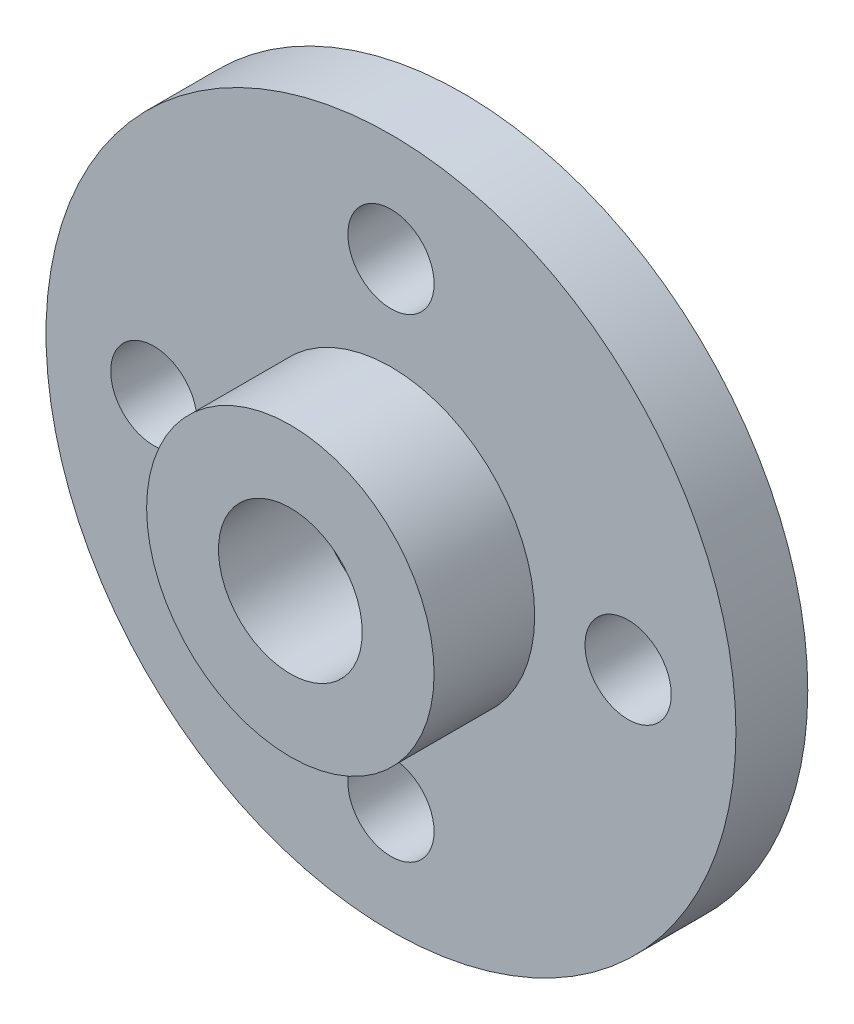
ISO-10303-21;
HEADER;
FILE_DESCRIPTION(('STEP AP214'),'2;1');
FILE_NAME('part.step','',(''),(''),'','','');
FILE_SCHEMA(('AUTOMOTIVE_DESIGN { 1 0 10303 214 1 1 1 1 }'));
ENDSEC;
DATA;
#1=APPLICATION_CONTEXT('core data for automotive mechanical design processes');
#2=APPLICATION_PROTOCOL_DEFINITION('international standard','automotive_design',2000,#1);
#3=PRODUCT_CONTEXT('',#1,'mechanical');
#4=PRODUCT('Part','Part','',(#3));
#5=PRODUCT_RELATED_PRODUCT_CATEGORY('part','',(#4));
#6=PRODUCT_DEFINITION_FORMATION('','',#4);
#7=PRODUCT_DEFINITION_CONTEXT('part definition',#1,'design');
#8=PRODUCT_DEFINITION('design','',#6,#7);
#9=PRODUCT_DEFINITION_SHAPE('','',#8);
#10=(LENGTH_UNIT() NAMED_UNIT(*) SI_UNIT(.MILLI.,.METRE.));
#11=(NAMED_UNIT(*) PLANE_ANGLE_UNIT() SI_UNIT($,.RADIAN.));
#12=(NAMED_UNIT(*) SI_UNIT($,.STERADIAN.) SOLID_ANGLE_UNIT());
#13=UNCERTAINTY_MEASURE_WITH_UNIT(LENGTH_MEASURE(1.E-05),#10,'distance_accuracy_value','');
#14=(GEOMETRIC_REPRESENTATION_CONTEXT(3) GLOBAL_UNCERTAINTY_ASSIGNED_CONTEXT((#13)) GLOBAL_UNIT_ASSIGNED_CONTEXT((#10,
#11,#12)) REPRESENTATION_CONTEXT('',''));
#15=CARTESIAN_POINT('',(0.,0.,0.));
#16=DIRECTION('',(0.,0.,1.));
#17=DIRECTION('',(1.,0.,0.));
#18=AXIS2_PLACEMENT_3D('',#15,#16,#17);
#19=CARTESIAN_POINT('',(0.,0.,2.5));
#20=DIRECTION('',(0.,0.,1.));
#21=DIRECTION('',(1.,0.,0.));
#22=AXIS2_PLACEMENT_3D('',#19,#20,#21);
#23=PLANE('',#22);
#24=CARTESIAN_POINT('',(0.,0.,2.5));
#25=DIRECTION('',(0.,0.,1.));
#26=DIRECTION('',(1.,0.,0.));
#27=AXIS2_PLACEMENT_3D('',#24,#25,#26);
#28=CIRCLE('',#27,1.5);
#29=CARTESIAN_POINT('',(1.5,0.,2.5));
#30=VERTEX_POINT('',#29);
#31=EDGE_CURVE('E48',#30,#30,#28,.T.);
#32=ORIENTED_EDGE('',*,*,#31,.F.);
#33=EDGE_LOOP('',(#32));
#34=FACE_BOUND('',#33,.T.);
#35=CARTESIAN_POINT('',(0.,0.,2.5));
#36=DIRECTION('',(0.,0.,1.));
#37=DIRECTION('',(1.,0.,0.));
#38=AXIS2_PLACEMENT_3D('',#35,#36,#37);
#39=CIRCLE('',#38,2.5);
#40=CARTESIAN_POINT('',(2.5,0.,2.5));
#41=VERTEX_POINT('',#40);
#42=EDGE_CURVE('E10',#41,#41,#39,.F.);
#43=ORIENTED_EDGE('',*,*,#42,.F.);
#44=EDGE_LOOP('',(#43));
#45=FACE_BOUND('',#44,.T.);
#46=ADVANCED_FACE('F32',(#34,#45),#23,.T.);
#47=CARTESIAN_POINT('',(0.,0.,2.5));
#48=DIRECTION('',(0.,0.,1.));
#49=DIRECTION('',(1.,0.,0.));
#50=AXIS2_PLACEMENT_3D('',#47,#48,#49);
#51=CIRCLE('',#50,5.);
#52=CARTESIAN_POINT('',(5.,0.,2.5));
#53=VERTEX_POINT('',#52);
#54=EDGE_CURVE('E80',#53,#53,#51,.T.);
#55=ORIENTED_EDGE('',*,*,#54,.F.);
#56=EDGE_LOOP('',(#55));
#57=FACE_BOUND('',#56,.T.);
#58=CARTESIAN_POINT('',(0.,-8.25,2.5));
#59=DIRECTION('',(0.,0.,1.));
#60=DIRECTION('',(1.,0.,0.));
#61=AXIS2_PLACEMENT_3D('',#58,#59,#60);
#62=CIRCLE('',#61,1.5);
#63=CARTESIAN_POINT('',(1.5,-8.25,2.5));
#64=VERTEX_POINT('',#63);
#65=EDGE_CURVE('E65',#64,#64,#62,.T.);
#66=ORIENTED_EDGE('',*,*,#65,.F.);
#67=EDGE_LOOP('',(#66));
#68=FACE_BOUND('',#67,.T.);
#69=CARTESIAN_POINT('',(0.,8.25,2.5));
#70=DIRECTION('',(0.,0.,1.));
#71=DIRECTION('',(1.,0.,0.));
#72=AXIS2_PLACEMENT_3D('',#69,#70,#71);
#73=CIRCLE('',#72,1.5);
#74=CARTESIAN_POINT('',(1.5,8.25,2.5));
#75=VERTEX_POINT('',#74);
#76=EDGE_CURVE('E53',#75,#75,#73,.T.);
#77=ORIENTED_EDGE('',*,*,#76,.F.);
#78=EDGE_LOOP('',(#77));
#79=FACE_BOUND('',#78,.T.);
#80=CARTESIAN_POINT('',(0.,0.,2.5));
#81=DIRECTION('',(0.,0.,1.));
#82=DIRECTION('',(1.,0.,0.));
#83=AXIS2_PLACEMENT_3D('',#80,#81,#82);
#84=CIRCLE('',#83,12.);
#85=CARTESIAN_POINT('',(12.,0.,2.5));
#86=VERTEX_POINT('',#85);
#87=EDGE_CURVE('E39',#86,#86,#84,.T.);
#88=ORIENTED_EDGE('',*,*,#87,.T.);
#89=EDGE_LOOP('',(#88));
#90=FACE_BOUND('',#89,.T.);
#91=CARTESIAN_POINT('',(8.25,0.,2.5));
#92=DIRECTION('',(0.,0.,1.));
#93=DIRECTION('',(1.,0.,0.));
#94=AXIS2_PLACEMENT_3D('',#91,#92,#93);
#95=CIRCLE('',#94,1.5);
#96=CARTESIAN_POINT('',(9.75,0.,2.5));
#97=VERTEX_POINT('',#96);
#98=EDGE_CURVE('E59',#97,#97,#95,.T.);
#99=ORIENTED_EDGE('',*,*,#98,.F.);
#100=EDGE_LOOP('',(#99));
#101=FACE_BOUND('',#100,.T.);
#102=CARTESIAN_POINT('',(-8.25,0.,2.5));
#103=DIRECTION('',(0.,0.,1.));
#104=DIRECTION('',(1.,0.,0.));
#105=AXIS2_PLACEMENT_3D('',#102,#103,#104);
#106=CIRCLE('',#105,1.5);
#107=CARTESIAN_POINT('',(-6.75,0.,2.5));
#108=VERTEX_POINT('',#107);
#109=EDGE_CURVE('E71',#108,#108,#106,.T.);
#110=ORIENTED_EDGE('',*,*,#109,.F.);
#111=EDGE_LOOP('',(#110));
#112=FACE_BOUND('',#111,.T.);
#113=ADVANCED_FACE('F108',(#57,#68,#79,#90,#101,#112),#23,.T.);
#114=CARTESIAN_POINT('',(0.,0.,0.));
#115=DIRECTION('',(0.,0.,1.));
#116=DIRECTION('',(1.,0.,0.));
#117=AXIS2_PLACEMENT_3D('',#114,#115,#116);
#118=PLANE('',#117);
#119=CARTESIAN_POINT('',(0.,0.,0.));
#120=DIRECTION('',(0.,0.,1.));
#121=DIRECTION('',(1.,0.,0.));
#122=AXIS2_PLACEMENT_3D('',#119,#120,#121);
#123=CIRCLE('',#122,12.);
#124=CARTESIAN_POINT('',(12.,0.,0.));
#125=VERTEX_POINT('',#124);
#126=EDGE_CURVE('E43',#125,#125,#123,.T.);
#127=ORIENTED_EDGE('',*,*,#126,.F.);
#128=EDGE_LOOP('',(#127));
#129=FACE_BOUND('',#128,.T.);
#130=CARTESIAN_POINT('',(0.,0.,0.));
#131=DIRECTION('',(0.,0.,1.));
#132=DIRECTION('',(1.,0.,0.));
#133=AXIS2_PLACEMENT_3D('',#130,#131,#132);
#134=CIRCLE('',#133,1.5);
#135=CARTESIAN_POINT('',(1.5,0.,0.));
#136=VERTEX_POINT('',#135);
#137=EDGE_CURVE('E50',#136,#136,#134,.T.);
#138=ORIENTED_EDGE('',*,*,#137,.T.);
#139=EDGE_LOOP('',(#138));
#140=FACE_BOUND('',#139,.T.);
#141=CARTESIAN_POINT('',(0.,8.25,0.));
#142=DIRECTION('',(0.,0.,1.));
#143=DIRECTION('',(1.,0.,0.));
#144=AXIS2_PLACEMENT_3D('',#141,#142,#143);
#145=CIRCLE('',#144,1.5);
#146=CARTESIAN_POINT('',(1.5,8.25,0.));
#147=VERTEX_POINT('',#146);
#148=EDGE_CURVE('E56',#147,#147,#145,.T.);
#149=ORIENTED_EDGE('',*,*,#148,.T.);
#150=EDGE_LOOP('',(#149));
#151=FACE_BOUND('',#150,.T.);
#152=CARTESIAN_POINT('',(8.25,0.,0.));
#153=DIRECTION('',(0.,0.,1.));
#154=DIRECTION('',(1.,0.,0.));
#155=AXIS2_PLACEMENT_3D('',#152,#153,#154);
#156=CIRCLE('',#155,1.5);
#157=CARTESIAN_POINT('',(9.75,0.,0.));
#158=VERTEX_POINT('',#157);
#159=EDGE_CURVE('E62',#158,#158,#156,.T.);
#160=ORIENTED_EDGE('',*,*,#159,.T.);
#161=EDGE_LOOP('',(#160));
#162=FACE_BOUND('',#161,.T.);
#163=CARTESIAN_POINT('',(0.,-8.25,0.));
#164=DIRECTION('',(0.,0.,1.));
#165=DIRECTION('',(1.,0.,0.));
#166=AXIS2_PLACEMENT_3D('',#163,#164,#165);
#167=CIRCLE('',#166,1.5);
#168=CARTESIAN_POINT('',(1.5,-8.25,0.));
#169=VERTEX_POINT('',#168);
#170=EDGE_CURVE('E68',#169,#169,#167,.T.);
#171=ORIENTED_EDGE('',*,*,#170,.T.);
#172=EDGE_LOOP('',(#171));
#173=FACE_BOUND('',#172,.T.);
#174=CARTESIAN_POINT('',(-8.25,0.,0.));
#175=DIRECTION('',(0.,0.,1.));
#176=DIRECTION('',(1.,0.,0.));
#177=AXIS2_PLACEMENT_3D('',#174,#175,#176);
#178=CIRCLE('',#177,1.5);
#179=CARTESIAN_POINT('',(-6.75,0.,0.));
#180=VERTEX_POINT('',#179);
#181=EDGE_CURVE('E74',#180,#180,#178,.T.);
#182=ORIENTED_EDGE('',*,*,#181,.T.);
#183=EDGE_LOOP('',(#182));
#184=FACE_BOUND('',#183,.T.);
#185=ADVANCED_FACE('F114',(#129,#140,#151,#162,#173,#184),#118,.F.);
#186=CARTESIAN_POINT('',(0.,0.,2.5));
#187=DIRECTION('',(0.,0.,-1.));
#188=DIRECTION('',(-1.,0.,0.));
#189=AXIS2_PLACEMENT_3D('',#186,#187,#188);
#190=CYLINDRICAL_SURFACE('',#189,12.);
#191=ORIENTED_EDGE('',*,*,#87,.F.);
#192=EDGE_LOOP('',(#191));
#193=FACE_BOUND('',#192,.T.);
#194=ORIENTED_EDGE('',*,*,#126,.T.);
#195=EDGE_LOOP('',(#194));
#196=FACE_BOUND('',#195,.T.);
#197=ADVANCED_FACE('F34',(#193,#196),#190,.T.);
#198=CARTESIAN_POINT('',(0.,0.,2.5));
#199=DIRECTION('',(0.,0.,-1.));
#200=DIRECTION('',(-1.,0.,0.));
#201=AXIS2_PLACEMENT_3D('',#198,#199,#200);
#202=CYLINDRICAL_SURFACE('',#201,1.5);
#203=ORIENTED_EDGE('',*,*,#31,.T.);
#204=EDGE_LOOP('',(#203));
#205=FACE_BOUND('',#204,.T.);
#206=ORIENTED_EDGE('',*,*,#137,.F.);
#207=EDGE_LOOP('',(#206));
#208=FACE_BOUND('',#207,.T.);
#209=ADVANCED_FACE('F119',(#205,#208),#202,.F.);
#210=CARTESIAN_POINT('',(0.,8.25,2.5));
#211=DIRECTION('',(0.,0.,-1.));
#212=DIRECTION('',(-1.,0.,0.));
#213=AXIS2_PLACEMENT_3D('',#210,#211,#212);
#214=CYLINDRICAL_SURFACE('',#213,1.5);
#215=ORIENTED_EDGE('',*,*,#76,.T.);
#216=EDGE_LOOP('',(#215));
#217=FACE_BOUND('',#216,.T.);
#218=ORIENTED_EDGE('',*,*,#148,.F.);
#219=EDGE_LOOP('',(#218));
#220=FACE_BOUND('',#219,.T.);
#221=ADVANCED_FACE('F147',(#217,#220),#214,.F.);
#222=CARTESIAN_POINT('',(8.25,0.,2.5));
#223=DIRECTION('',(0.,0.,-1.));
#224=DIRECTION('',(-1.,0.,0.));
#225=AXIS2_PLACEMENT_3D('',#222,#223,#224);
#226=CYLINDRICAL_SURFACE('',#225,1.5);
#227=ORIENTED_EDGE('',*,*,#98,.T.);
#228=EDGE_LOOP('',(#227));
#229=FACE_BOUND('',#228,.T.);
#230=ORIENTED_EDGE('',*,*,#159,.F.);
#231=EDGE_LOOP('',(#230));
#232=FACE_BOUND('',#231,.T.);
#233=ADVANCED_FACE('F141',(#229,#232),#226,.F.);
#234=CARTESIAN_POINT('',(0.,-8.25,2.5));
#235=DIRECTION('',(0.,0.,-1.));
#236=DIRECTION('',(-1.,0.,0.));
#237=AXIS2_PLACEMENT_3D('',#234,#235,#236);
#238=CYLINDRICAL_SURFACE('',#237,1.5);
#239=ORIENTED_EDGE('',*,*,#65,.T.);
#240=EDGE_LOOP('',(#239));
#241=FACE_BOUND('',#240,.T.);
#242=ORIENTED_EDGE('',*,*,#170,.F.);
#243=EDGE_LOOP('',(#242));
#244=FACE_BOUND('',#243,.T.);
#245=ADVANCED_FACE('F103',(#241,#244),#238,.F.);
#246=CARTESIAN_POINT('',(-8.25,0.,2.5));
#247=DIRECTION('',(0.,0.,-1.));
#248=DIRECTION('',(-1.,0.,0.));
#249=AXIS2_PLACEMENT_3D('',#246,#247,#248);
#250=CYLINDRICAL_SURFACE('',#249,1.5);
#251=ORIENTED_EDGE('',*,*,#109,.T.);
#252=EDGE_LOOP('',(#251));
#253=FACE_BOUND('',#252,.T.);
#254=ORIENTED_EDGE('',*,*,#181,.F.);
#255=EDGE_LOOP('',(#254));
#256=FACE_BOUND('',#255,.T.);
#257=ADVANCED_FACE('F94',(#253,#256),#250,.F.);
#258=CARTESIAN_POINT('',(0.,0.,6.));
#259=DIRECTION('',(0.,0.,1.));
#260=DIRECTION('',(1.,0.,0.));
#261=AXIS2_PLACEMENT_3D('',#258,#259,#260);
#262=PLANE('',#261);
#263=CARTESIAN_POINT('',(0.,0.,6.));
#264=DIRECTION('',(0.,0.,1.));
#265=DIRECTION('',(1.,0.,0.));
#266=AXIS2_PLACEMENT_3D('',#263,#264,#265);
#267=CIRCLE('',#266,5.);
#268=CARTESIAN_POINT('',(5.,0.,6.));
#269=VERTEX_POINT('',#268);
#270=EDGE_CURVE('E77',#269,#269,#267,.T.);
#271=ORIENTED_EDGE('',*,*,#270,.T.);
#272=EDGE_LOOP('',(#271));
#273=FACE_BOUND('',#272,.T.);
#274=CARTESIAN_POINT('',(0.,0.,6.));
#275=DIRECTION('',(0.,0.,1.));
#276=DIRECTION('',(1.,0.,0.));
#277=AXIS2_PLACEMENT_3D('',#274,#275,#276);
#278=CIRCLE('',#277,2.5);
#279=CARTESIAN_POINT('',(2.5,0.,6.));
#280=VERTEX_POINT('',#279);
#281=EDGE_CURVE('E83',#280,#280,#278,.T.);
#282=ORIENTED_EDGE('',*,*,#281,.F.);
#283=EDGE_LOOP('',(#282));
#284=FACE_BOUND('',#283,.T.);
#285=ADVANCED_FACE('F91',(#273,#284),#262,.T.);
#286=CARTESIAN_POINT('',(0.,0.,6.));
#287=DIRECTION('',(0.,0.,-1.));
#288=DIRECTION('',(-1.,0.,0.));
#289=AXIS2_PLACEMENT_3D('',#286,#287,#288);
#290=CYLINDRICAL_SURFACE('',#289,5.);
#291=ORIENTED_EDGE('',*,*,#270,.F.);
#292=EDGE_LOOP('',(#291));
#293=FACE_BOUND('',#292,.T.);
#294=ORIENTED_EDGE('',*,*,#54,.T.);
#295=EDGE_LOOP('',(#294));
#296=FACE_BOUND('',#295,.T.);
#297=ADVANCED_FACE('F93',(#293,#296),#290,.T.);
#298=CARTESIAN_POINT('',(0.,0.,6.));
#299=DIRECTION('',(0.,0.,-1.));
#300=DIRECTION('',(-1.,0.,0.));
#301=AXIS2_PLACEMENT_3D('',#298,#299,#300);
#302=CYLINDRICAL_SURFACE('',#301,2.5);
#303=ORIENTED_EDGE('',*,*,#281,.T.);
#304=EDGE_LOOP('',(#303));
#305=FACE_BOUND('',#304,.T.);
#306=ORIENTED_EDGE('',*,*,#42,.T.);
#307=EDGE_LOOP('',(#306));
#308=FACE_BOUND('',#307,.T.);
#309=ADVANCED_FACE('F89',(#305,#308),#302,.F.);
#310=CLOSED_SHELL('',(#46,#113,#185,#197,#209,#221,#233,#245,#257,#285,#297,#309));
#311=MANIFOLD_SOLID_BREP('B2',#310);
#312=ADVANCED_BREP_SHAPE_REPRESENTATION('',(#18,#311),#14);
#313=SHAPE_DEFINITION_REPRESENTATION(#9,#312);
ENDSEC;
END-ISO-10303-21;
